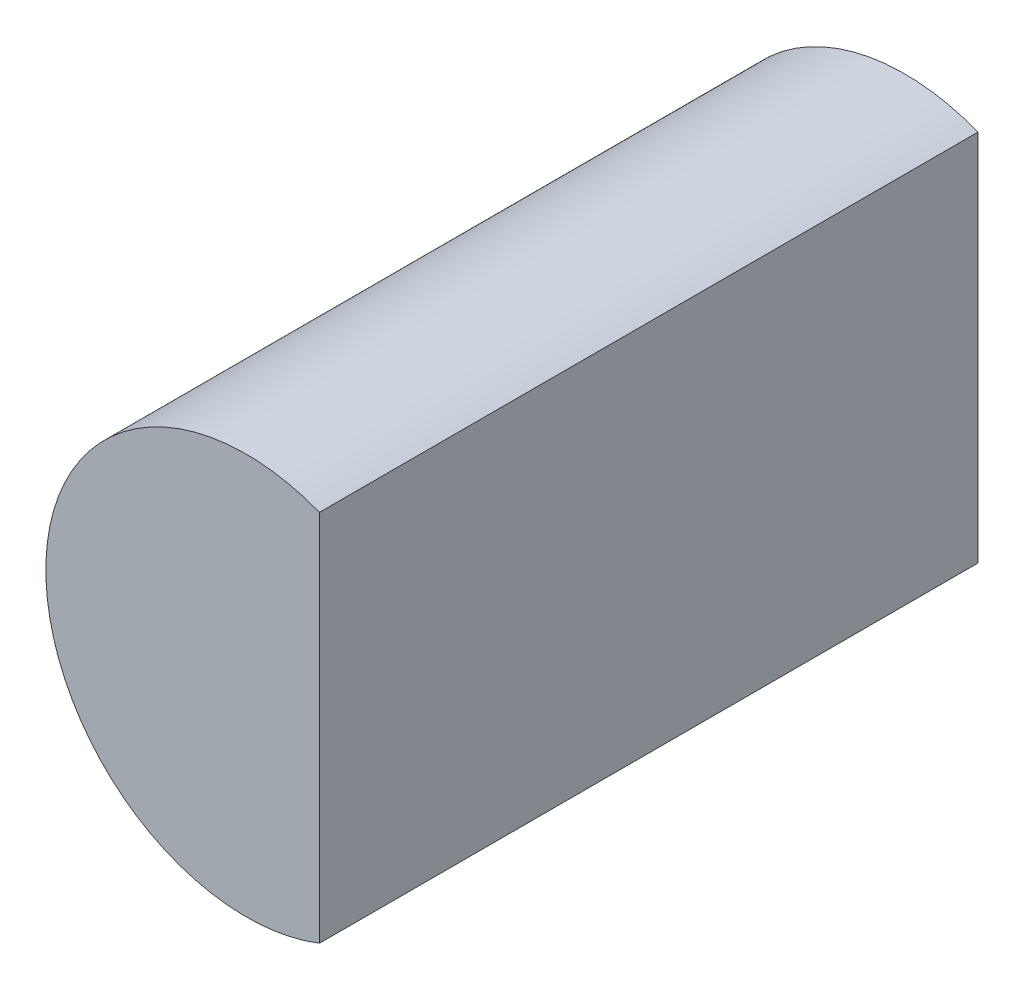
ISO-10303-21;
HEADER;
FILE_DESCRIPTION(('STEP AP214'),'2;1');
FILE_NAME('part.step','',(''),(''),'','','');
FILE_SCHEMA(('AUTOMOTIVE_DESIGN { 1 0 10303 214 1 1 1 1 }'));
ENDSEC;
DATA;
#1=APPLICATION_CONTEXT('core data for automotive mechanical design processes');
#2=APPLICATION_PROTOCOL_DEFINITION('international standard','automotive_design',2000,#1);
#3=PRODUCT_CONTEXT('',#1,'mechanical');
#4=PRODUCT('Part','Part','',(#3));
#5=PRODUCT_RELATED_PRODUCT_CATEGORY('part','',(#4));
#6=PRODUCT_DEFINITION_FORMATION('','',#4);
#7=PRODUCT_DEFINITION_CONTEXT('part definition',#1,'design');
#8=PRODUCT_DEFINITION('design','',#6,#7);
#9=PRODUCT_DEFINITION_SHAPE('','',#8);
#10=(LENGTH_UNIT() NAMED_UNIT(*) SI_UNIT(.MILLI.,.METRE.));
#11=(NAMED_UNIT(*) PLANE_ANGLE_UNIT() SI_UNIT($,.RADIAN.));
#12=(NAMED_UNIT(*) SI_UNIT($,.STERADIAN.) SOLID_ANGLE_UNIT());
#13=UNCERTAINTY_MEASURE_WITH_UNIT(LENGTH_MEASURE(1.E-05),#10,'distance_accuracy_value','');
#14=(GEOMETRIC_REPRESENTATION_CONTEXT(3) GLOBAL_UNCERTAINTY_ASSIGNED_CONTEXT((#13)) GLOBAL_UNIT_ASSIGNED_CONTEXT((#10,
#11,#12)) REPRESENTATION_CONTEXT('',''));
#15=CARTESIAN_POINT('',(0.,0.,0.));
#16=DIRECTION('',(0.,0.,1.));
#17=DIRECTION('',(1.,0.,0.));
#18=AXIS2_PLACEMENT_3D('',#15,#16,#17);
#19=CARTESIAN_POINT('',(0.,0.,18.));
#20=DIRECTION('',(0.,0.,-1.));
#21=DIRECTION('',(-1.,0.,0.));
#22=AXIS2_PLACEMENT_3D('',#19,#20,#21);
#23=CYLINDRICAL_SURFACE('',#22,5.47813836992094);
#24=CARTESIAN_POINT('',(0.,0.,0.));
#25=DIRECTION('',(0.,0.,1.));
#26=DIRECTION('',(1.,0.,0.));
#27=AXIS2_PLACEMENT_3D('',#24,#25,#26);
#28=CIRCLE('',#27,5.47813836992094);
#29=CARTESIAN_POINT('',(2.,5.1,0.));
#30=VERTEX_POINT('',#29);
#31=CARTESIAN_POINT('',(2.,-5.1,0.));
#32=VERTEX_POINT('',#31);
#33=EDGE_CURVE('E72',#30,#32,#28,.T.);
#34=ORIENTED_EDGE('',*,*,#33,.T.);
#35=DIRECTION('',(0.,0.,-1.));
#36=VECTOR('',#35,1.);
#37=CARTESIAN_POINT('',(2.,-5.1,18.));
#38=LINE('',#37,#36);
#39=CARTESIAN_POINT('',(2.,-5.1,18.));
#40=VERTEX_POINT('',#39);
#41=EDGE_CURVE('E11',#40,#32,#38,.T.);
#42=ORIENTED_EDGE('',*,*,#41,.F.);
#43=CARTESIAN_POINT('',(0.,0.,18.));
#44=DIRECTION('',(0.,0.,1.));
#45=DIRECTION('',(1.,0.,0.));
#46=AXIS2_PLACEMENT_3D('',#43,#44,#45);
#47=CIRCLE('',#46,5.47813836992094);
#48=CARTESIAN_POINT('',(2.,5.1,18.));
#49=VERTEX_POINT('',#48);
#50=EDGE_CURVE('E71',#49,#40,#47,.T.);
#51=ORIENTED_EDGE('',*,*,#50,.F.);
#52=DIRECTION('',(0.,0.,-1.));
#53=VECTOR('',#52,1.);
#54=CARTESIAN_POINT('',(2.,5.1,18.));
#55=LINE('',#54,#53);
#56=EDGE_CURVE('E49',#49,#30,#55,.T.);
#57=ORIENTED_EDGE('',*,*,#56,.T.);
#58=EDGE_LOOP('',(#34,#42,#51,#57));
#59=FACE_BOUND('',#58,.T.);
#60=ADVANCED_FACE('F41',(#59),#23,.T.);
#61=CARTESIAN_POINT('',(2.,-5.1,18.));
#62=DIRECTION('',(-1.,0.,0.));
#63=DIRECTION('',(0.,0.,1.));
#64=AXIS2_PLACEMENT_3D('',#61,#62,#63);
#65=PLANE('',#64);
#66=DIRECTION('',(0.,1.,0.));
#67=VECTOR('',#66,1.);
#68=CARTESIAN_POINT('',(2.,-5.1,0.));
#69=LINE('',#68,#67);
#70=EDGE_CURVE('E64',#32,#30,#69,.T.);
#71=ORIENTED_EDGE('',*,*,#70,.T.);
#72=ORIENTED_EDGE('',*,*,#56,.F.);
#73=DIRECTION('',(0.,1.,0.));
#74=VECTOR('',#73,1.);
#75=CARTESIAN_POINT('',(2.,-5.1,18.));
#76=LINE('',#75,#74);
#77=EDGE_CURVE('E56',#40,#49,#76,.T.);
#78=ORIENTED_EDGE('',*,*,#77,.F.);
#79=ORIENTED_EDGE('',*,*,#41,.T.);
#80=EDGE_LOOP('',(#71,#72,#78,#79));
#81=FACE_BOUND('',#80,.T.);
#82=ADVANCED_FACE('F67',(#81),#65,.F.);
#83=CARTESIAN_POINT('',(0.,0.,18.));
#84=DIRECTION('',(0.,0.,1.));
#85=DIRECTION('',(1.,0.,0.));
#86=AXIS2_PLACEMENT_3D('',#83,#84,#85);
#87=PLANE('',#86);
#88=ORIENTED_EDGE('',*,*,#50,.T.);
#89=ORIENTED_EDGE('',*,*,#77,.T.);
#90=EDGE_LOOP('',(#88,#89));
#91=FACE_BOUND('',#90,.T.);
#92=ADVANCED_FACE('F79',(#91),#87,.T.);
#93=CARTESIAN_POINT('',(0.,0.,0.));
#94=DIRECTION('',(0.,0.,1.));
#95=DIRECTION('',(1.,0.,0.));
#96=AXIS2_PLACEMENT_3D('',#93,#94,#95);
#97=PLANE('',#96);
#98=ORIENTED_EDGE('',*,*,#33,.F.);
#99=ORIENTED_EDGE('',*,*,#70,.F.);
#100=EDGE_LOOP('',(#98,#99));
#101=FACE_BOUND('',#100,.T.);
#102=ADVANCED_FACE('F75',(#101),#97,.F.);
#103=CLOSED_SHELL('',(#60,#82,#92,#102));
#104=MANIFOLD_SOLID_BREP('B2',#103);
#105=ADVANCED_BREP_SHAPE_REPRESENTATION('',(#18,#104),#14);
#106=SHAPE_DEFINITION_REPRESENTATION(#9,#105);
ENDSEC;
END-ISO-10303-21;
